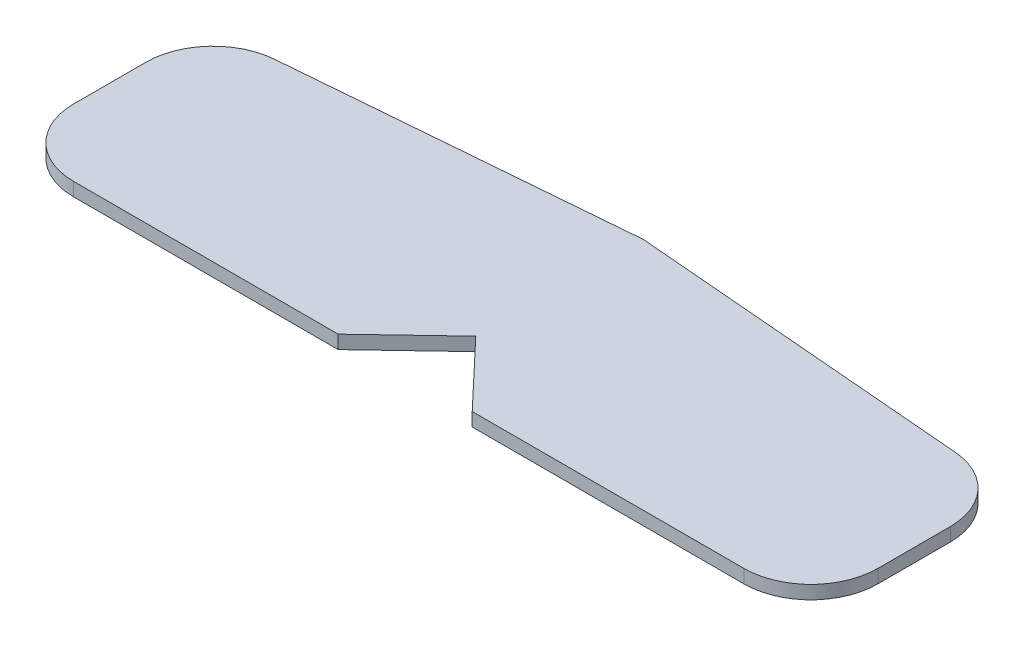
ISO-10303-21;
HEADER;
FILE_DESCRIPTION(('STEP AP214'),'2;1');
FILE_NAME('part.step','',(''),(''),'','','');
FILE_SCHEMA(('AUTOMOTIVE_DESIGN { 1 0 10303 214 1 1 1 1 }'));
ENDSEC;
DATA;
#1=APPLICATION_CONTEXT('core data for automotive mechanical design processes');
#2=APPLICATION_PROTOCOL_DEFINITION('international standard','automotive_design',2000,#1);
#3=PRODUCT_CONTEXT('',#1,'mechanical');
#4=PRODUCT('Part','Part','',(#3));
#5=PRODUCT_RELATED_PRODUCT_CATEGORY('part','',(#4));
#6=PRODUCT_DEFINITION_FORMATION('','',#4);
#7=PRODUCT_DEFINITION_CONTEXT('part definition',#1,'design');
#8=PRODUCT_DEFINITION('design','',#6,#7);
#9=PRODUCT_DEFINITION_SHAPE('','',#8);
#10=(LENGTH_UNIT() NAMED_UNIT(*) SI_UNIT(.MILLI.,.METRE.));
#11=(NAMED_UNIT(*) PLANE_ANGLE_UNIT() SI_UNIT($,.RADIAN.));
#12=(NAMED_UNIT(*) SI_UNIT($,.STERADIAN.) SOLID_ANGLE_UNIT());
#13=UNCERTAINTY_MEASURE_WITH_UNIT(LENGTH_MEASURE(1.E-05),#10,'distance_accuracy_value','');
#14=(GEOMETRIC_REPRESENTATION_CONTEXT(3) GLOBAL_UNCERTAINTY_ASSIGNED_CONTEXT((#13)) GLOBAL_UNIT_ASSIGNED_CONTEXT((#10,
#11,#12)) REPRESENTATION_CONTEXT('',''));
#15=CARTESIAN_POINT('',(0.,0.,0.));
#16=DIRECTION('',(0.,0.,1.));
#17=DIRECTION('',(1.,0.,0.));
#18=AXIS2_PLACEMENT_3D('',#15,#16,#17);
#19=CARTESIAN_POINT('',(50.,2.,-3.29867118433976));
#20=DIRECTION('',(0.,-1.,0.));
#21=DIRECTION('',(0.,0.,-1.));
#22=AXIS2_PLACEMENT_3D('',#19,#20,#21);
#23=CYLINDRICAL_SURFACE('',#22,10.);
#24=CARTESIAN_POINT('',(50.,0.,-3.29867118433976));
#25=DIRECTION('',(0.,1.,0.));
#26=DIRECTION('',(0.,0.,-1.));
#27=AXIS2_PLACEMENT_3D('',#24,#25,#26);
#28=CIRCLE('',#27,10.);
#29=CARTESIAN_POINT('',(60.,0.,-3.29867118433969));
#30=VERTEX_POINT('',#29);
#31=CARTESIAN_POINT('',(50.8304547985373,0.,-13.2641287667886));
#32=VERTEX_POINT('',#31);
#33=EDGE_CURVE('E170',#30,#32,#28,.T.);
#34=ORIENTED_EDGE('',*,*,#33,.T.);
#35=DIRECTION('',(0.,-1.,0.));
#36=VECTOR('',#35,1.);
#37=CARTESIAN_POINT('',(50.8304547985373,2.,-13.2641287667886));
#38=LINE('',#37,#36);
#39=CARTESIAN_POINT('',(50.8304547985373,2.,-13.2641287667886));
#40=VERTEX_POINT('',#39);
#41=EDGE_CURVE('E11',#40,#32,#38,.T.);
#42=ORIENTED_EDGE('',*,*,#41,.F.);
#43=CARTESIAN_POINT('',(50.,2.,-3.29867118433976));
#44=DIRECTION('',(0.,1.,0.));
#45=DIRECTION('',(0.,0.,-1.));
#46=AXIS2_PLACEMENT_3D('',#43,#44,#45);
#47=CIRCLE('',#46,10.);
#48=CARTESIAN_POINT('',(60.,2.,-3.29867118433969));
#49=VERTEX_POINT('',#48);
#50=EDGE_CURVE('E204',#49,#40,#47,.T.);
#51=ORIENTED_EDGE('',*,*,#50,.F.);
#52=DIRECTION('',(0.,-1.,0.));
#53=VECTOR('',#52,1.);
#54=CARTESIAN_POINT('',(60.,2.,-3.29867118433969));
#55=LINE('',#54,#53);
#56=EDGE_CURVE('E166',#49,#30,#55,.T.);
#57=ORIENTED_EDGE('',*,*,#56,.T.);
#58=EDGE_LOOP('',(#34,#42,#51,#57));
#59=FACE_BOUND('',#58,.T.);
#60=ADVANCED_FACE('F45',(#59),#23,.T.);
#61=CARTESIAN_POINT('',(0.,2.,-17.5));
#62=DIRECTION('',(-0.08304547985374,0.,0.99654575824488));
#63=DIRECTION('',(0.99654575824488,0.,0.08304547985374));
#64=AXIS2_PLACEMENT_3D('',#61,#62,#63);
#65=PLANE('',#64);
#66=DIRECTION('',(-0.99654575824488,0.,-0.08304547985374));
#67=VECTOR('',#66,1.);
#68=CARTESIAN_POINT('',(0.,0.,-17.5));
#69=LINE('',#68,#67);
#70=CARTESIAN_POINT('',(0.,0.,-17.5));
#71=VERTEX_POINT('',#70);
#72=EDGE_CURVE('E174',#32,#71,#69,.T.);
#73=ORIENTED_EDGE('',*,*,#72,.T.);
#74=DIRECTION('',(0.,-1.,0.));
#75=VECTOR('',#74,1.);
#76=CARTESIAN_POINT('',(0.,2.,-17.5));
#77=LINE('',#76,#75);
#78=CARTESIAN_POINT('',(0.,2.,-17.5));
#79=VERTEX_POINT('',#78);
#80=EDGE_CURVE('E54',#79,#71,#77,.T.);
#81=ORIENTED_EDGE('',*,*,#80,.F.);
#82=DIRECTION('',(-0.99654575824488,0.,-0.08304547985374));
#83=VECTOR('',#82,1.);
#84=CARTESIAN_POINT('',(0.,2.,-17.5));
#85=LINE('',#84,#83);
#86=EDGE_CURVE('E117',#40,#79,#85,.T.);
#87=ORIENTED_EDGE('',*,*,#86,.F.);
#88=ORIENTED_EDGE('',*,*,#41,.T.);
#89=EDGE_LOOP('',(#73,#81,#87,#88));
#90=FACE_BOUND('',#89,.T.);
#91=ADVANCED_FACE('F298',(#90),#65,.F.);
#92=CARTESIAN_POINT('',(-50.8304547985373,2.,-13.2641287667886));
#93=DIRECTION('',(0.08304547985374,0.,0.99654575824488));
#94=DIRECTION('',(0.99654575824488,0.,-0.08304547985374));
#95=AXIS2_PLACEMENT_3D('',#92,#93,#94);
#96=PLANE('',#95);
#97=DIRECTION('',(-0.99654575824488,0.,0.08304547985374));
#98=VECTOR('',#97,1.);
#99=CARTESIAN_POINT('',(-50.8304547985373,0.,-13.2641287667886));
#100=LINE('',#99,#98);
#101=CARTESIAN_POINT('',(-50.8304547985373,0.,-13.2641287667886));
#102=VERTEX_POINT('',#101);
#103=EDGE_CURVE('E177',#71,#102,#100,.T.);
#104=ORIENTED_EDGE('',*,*,#103,.T.);
#105=DIRECTION('',(0.,-1.,0.));
#106=VECTOR('',#105,1.);
#107=CARTESIAN_POINT('',(-50.8304547985373,2.,-13.2641287667886));
#108=LINE('',#107,#106);
#109=CARTESIAN_POINT('',(-50.8304547985373,2.,-13.2641287667886));
#110=VERTEX_POINT('',#109);
#111=EDGE_CURVE('E231',#110,#102,#108,.T.);
#112=ORIENTED_EDGE('',*,*,#111,.F.);
#113=DIRECTION('',(-0.99654575824488,0.,0.08304547985374));
#114=VECTOR('',#113,1.);
#115=CARTESIAN_POINT('',(-50.8304547985373,2.,-13.2641287667886));
#116=LINE('',#115,#114);
#117=EDGE_CURVE('E241',#79,#110,#116,.T.);
#118=ORIENTED_EDGE('',*,*,#117,.F.);
#119=ORIENTED_EDGE('',*,*,#80,.T.);
#120=EDGE_LOOP('',(#104,#112,#118,#119));
#121=FACE_BOUND('',#120,.T.);
#122=ADVANCED_FACE('F239',(#121),#96,.F.);
#123=CARTESIAN_POINT('',(-50.,2.,-3.29867118433976));
#124=DIRECTION('',(0.,-1.,0.));
#125=DIRECTION('',(0.,0.,-1.));
#126=AXIS2_PLACEMENT_3D('',#123,#124,#125);
#127=CYLINDRICAL_SURFACE('',#126,10.);
#128=CARTESIAN_POINT('',(-50.,0.,-3.29867118433976));
#129=DIRECTION('',(0.,1.,0.));
#130=DIRECTION('',(0.,0.,1.));
#131=AXIS2_PLACEMENT_3D('',#128,#129,#130);
#132=CIRCLE('',#131,10.);
#133=CARTESIAN_POINT('',(-60.,0.,-3.2986711843397));
#134=VERTEX_POINT('',#133);
#135=EDGE_CURVE('E180',#102,#134,#132,.T.);
#136=ORIENTED_EDGE('',*,*,#135,.T.);
#137=DIRECTION('',(0.,-1.,0.));
#138=VECTOR('',#137,1.);
#139=CARTESIAN_POINT('',(-60.,2.,-3.2986711843397));
#140=LINE('',#139,#138);
#141=CARTESIAN_POINT('',(-60.,2.,-3.2986711843397));
#142=VERTEX_POINT('',#141);
#143=EDGE_CURVE('E227',#142,#134,#140,.T.);
#144=ORIENTED_EDGE('',*,*,#143,.F.);
#145=CARTESIAN_POINT('',(-50.,2.,-3.29867118433976));
#146=DIRECTION('',(0.,1.,0.));
#147=DIRECTION('',(0.,0.,1.));
#148=AXIS2_PLACEMENT_3D('',#145,#146,#147);
#149=CIRCLE('',#148,10.);
#150=EDGE_CURVE('E260',#110,#142,#149,.T.);
#151=ORIENTED_EDGE('',*,*,#150,.F.);
#152=ORIENTED_EDGE('',*,*,#111,.T.);
#153=EDGE_LOOP('',(#136,#144,#151,#152));
#154=FACE_BOUND('',#153,.T.);
#155=ADVANCED_FACE('F250',(#154),#127,.T.);
#156=CARTESIAN_POINT('',(-60.,2.,7.49999999999993));
#157=DIRECTION('',(1.,0.,0.));
#158=DIRECTION('',(0.,0.,-1.));
#159=AXIS2_PLACEMENT_3D('',#156,#157,#158);
#160=PLANE('',#159);
#161=DIRECTION('',(0.,0.,1.));
#162=VECTOR('',#161,1.);
#163=CARTESIAN_POINT('',(-60.,0.,7.49999999999993));
#164=LINE('',#163,#162);
#165=CARTESIAN_POINT('',(-60.,0.,7.49999999999993));
#166=VERTEX_POINT('',#165);
#167=EDGE_CURVE('E183',#134,#166,#164,.T.);
#168=ORIENTED_EDGE('',*,*,#167,.T.);
#169=DIRECTION('',(0.,-1.,0.));
#170=VECTOR('',#169,1.);
#171=CARTESIAN_POINT('',(-60.,2.,7.49999999999993));
#172=LINE('',#171,#170);
#173=CARTESIAN_POINT('',(-60.,2.,7.49999999999993));
#174=VERTEX_POINT('',#173);
#175=EDGE_CURVE('E223',#174,#166,#172,.T.);
#176=ORIENTED_EDGE('',*,*,#175,.F.);
#177=DIRECTION('',(0.,0.,1.));
#178=VECTOR('',#177,1.);
#179=CARTESIAN_POINT('',(-60.,2.,7.49999999999993));
#180=LINE('',#179,#178);
#181=EDGE_CURVE('E256',#142,#174,#180,.T.);
#182=ORIENTED_EDGE('',*,*,#181,.F.);
#183=ORIENTED_EDGE('',*,*,#143,.T.);
#184=EDGE_LOOP('',(#168,#176,#182,#183));
#185=FACE_BOUND('',#184,.T.);
#186=ADVANCED_FACE('F254',(#185),#160,.F.);
#187=CARTESIAN_POINT('',(-50.,2.,7.5));
#188=DIRECTION('',(0.,-1.,0.));
#189=DIRECTION('',(0.,0.,-1.));
#190=AXIS2_PLACEMENT_3D('',#187,#188,#189);
#191=CYLINDRICAL_SURFACE('',#190,10.);
#192=CARTESIAN_POINT('',(-50.,0.,7.5));
#193=DIRECTION('',(0.,1.,0.));
#194=DIRECTION('',(0.,0.,-1.));
#195=AXIS2_PLACEMENT_3D('',#192,#193,#194);
#196=CIRCLE('',#195,10.);
#197=CARTESIAN_POINT('',(-49.9999999999999,0.,17.5));
#198=VERTEX_POINT('',#197);
#199=EDGE_CURVE('E186',#166,#198,#196,.T.);
#200=ORIENTED_EDGE('',*,*,#199,.T.);
#201=DIRECTION('',(0.,-1.,0.));
#202=VECTOR('',#201,1.);
#203=CARTESIAN_POINT('',(-49.9999999999999,2.,17.5));
#204=LINE('',#203,#202);
#205=CARTESIAN_POINT('',(-49.9999999999999,2.,17.5));
#206=VERTEX_POINT('',#205);
#207=EDGE_CURVE('E219',#206,#198,#204,.T.);
#208=ORIENTED_EDGE('',*,*,#207,.F.);
#209=CARTESIAN_POINT('',(-50.,2.,7.5));
#210=DIRECTION('',(0.,1.,0.));
#211=DIRECTION('',(0.,0.,-1.));
#212=AXIS2_PLACEMENT_3D('',#209,#210,#211);
#213=CIRCLE('',#212,10.);
#214=EDGE_CURVE('E259',#174,#206,#213,.T.);
#215=ORIENTED_EDGE('',*,*,#214,.F.);
#216=ORIENTED_EDGE('',*,*,#175,.T.);
#217=EDGE_LOOP('',(#200,#208,#215,#216));
#218=FACE_BOUND('',#217,.T.);
#219=ADVANCED_FACE('F311',(#218),#191,.T.);
#220=CARTESIAN_POINT('',(-49.9999999999999,2.,17.5));
#221=DIRECTION('',(0.,0.,-1.));
#222=DIRECTION('',(-1.,0.,0.));
#223=AXIS2_PLACEMENT_3D('',#220,#221,#222);
#224=PLANE('',#223);
#225=DIRECTION('',(1.,0.,0.));
#226=VECTOR('',#225,1.);
#227=CARTESIAN_POINT('',(-49.9999999999999,0.,17.5));
#228=LINE('',#227,#226);
#229=CARTESIAN_POINT('',(-10.5290456431535,0.,17.5));
#230=VERTEX_POINT('',#229);
#231=EDGE_CURVE('E189',#198,#230,#228,.T.);
#232=ORIENTED_EDGE('',*,*,#231,.T.);
#233=DIRECTION('',(0.,-1.,0.));
#234=VECTOR('',#233,1.);
#235=CARTESIAN_POINT('',(-10.5290456431535,2.,17.5));
#236=LINE('',#235,#234);
#237=CARTESIAN_POINT('',(-10.5290456431535,2.,17.5));
#238=VERTEX_POINT('',#237);
#239=EDGE_CURVE('E215',#238,#230,#236,.T.);
#240=ORIENTED_EDGE('',*,*,#239,.F.);
#241=DIRECTION('',(1.,0.,0.));
#242=VECTOR('',#241,1.);
#243=CARTESIAN_POINT('',(-49.9999999999999,2.,17.5));
#244=LINE('',#243,#242);
#245=EDGE_CURVE('E264',#206,#238,#244,.T.);
#246=ORIENTED_EDGE('',*,*,#245,.F.);
#247=ORIENTED_EDGE('',*,*,#207,.T.);
#248=EDGE_LOOP('',(#232,#240,#246,#247));
#249=FACE_BOUND('',#248,.T.);
#250=ADVANCED_FACE('F314',(#249),#224,.F.);
#251=CARTESIAN_POINT('',(-10.5290456431535,2.,17.5));
#252=DIRECTION('',(-0.688655583209343,0.,-0.725088606802368));
#253=DIRECTION('',(-0.725088606802368,0.,0.688655583209343));
#254=AXIS2_PLACEMENT_3D('',#251,#252,#253);
#255=PLANE('',#254);
#256=DIRECTION('',(0.725088606802368,0.,-0.688655583209343));
#257=VECTOR('',#256,1.);
#258=CARTESIAN_POINT('',(-10.5290456431535,0.,17.5));
#259=LINE('',#258,#257);
#260=CARTESIAN_POINT('',(0.,0.,7.5));
#261=VERTEX_POINT('',#260);
#262=EDGE_CURVE('E192',#230,#261,#259,.T.);
#263=ORIENTED_EDGE('',*,*,#262,.T.);
#264=DIRECTION('',(0.,-1.,0.));
#265=VECTOR('',#264,1.);
#266=CARTESIAN_POINT('',(0.,2.,7.5));
#267=LINE('',#266,#265);
#268=CARTESIAN_POINT('',(0.,2.,7.5));
#269=VERTEX_POINT('',#268);
#270=EDGE_CURVE('E211',#269,#261,#267,.T.);
#271=ORIENTED_EDGE('',*,*,#270,.F.);
#272=DIRECTION('',(0.725088606802368,0.,-0.688655583209343));
#273=VECTOR('',#272,1.);
#274=CARTESIAN_POINT('',(-10.5290456431535,2.,17.5));
#275=LINE('',#274,#273);
#276=EDGE_CURVE('E271',#238,#269,#275,.T.);
#277=ORIENTED_EDGE('',*,*,#276,.F.);
#278=ORIENTED_EDGE('',*,*,#239,.T.);
#279=EDGE_LOOP('',(#263,#271,#277,#278));
#280=FACE_BOUND('',#279,.T.);
#281=ADVANCED_FACE('F279',(#280),#255,.F.);
#282=CARTESIAN_POINT('',(0.,2.,7.5));
#283=DIRECTION('',(0.726051632454601,0.,-0.68764018716914));
#284=DIRECTION('',(-0.68764018716914,0.,-0.726051632454601));
#285=AXIS2_PLACEMENT_3D('',#282,#283,#284);
#286=PLANE('',#285);
#287=DIRECTION('',(0.68764018716914,0.,0.726051632454601));
#288=VECTOR('',#287,1.);
#289=CARTESIAN_POINT('',(0.,0.,7.5));
#290=LINE('',#289,#288);
#291=CARTESIAN_POINT('',(9.47095435684648,0.,17.5));
#292=VERTEX_POINT('',#291);
#293=EDGE_CURVE('E195',#261,#292,#290,.T.);
#294=ORIENTED_EDGE('',*,*,#293,.T.);
#295=DIRECTION('',(0.,-1.,0.));
#296=VECTOR('',#295,1.);
#297=CARTESIAN_POINT('',(9.47095435684648,2.,17.5));
#298=LINE('',#297,#296);
#299=CARTESIAN_POINT('',(9.47095435684648,2.,17.5));
#300=VERTEX_POINT('',#299);
#301=EDGE_CURVE('E159',#300,#292,#298,.T.);
#302=ORIENTED_EDGE('',*,*,#301,.F.);
#303=DIRECTION('',(0.68764018716914,0.,0.726051632454601));
#304=VECTOR('',#303,1.);
#305=CARTESIAN_POINT('',(0.,2.,7.5));
#306=LINE('',#305,#304);
#307=EDGE_CURVE('E148',#269,#300,#306,.T.);
#308=ORIENTED_EDGE('',*,*,#307,.F.);
#309=ORIENTED_EDGE('',*,*,#270,.T.);
#310=EDGE_LOOP('',(#294,#302,#308,#309));
#311=FACE_BOUND('',#310,.T.);
#312=ADVANCED_FACE('F283',(#311),#286,.F.);
#313=CARTESIAN_POINT('',(9.47095435684648,2.,17.5));
#314=DIRECTION('',(0.,0.,-1.));
#315=DIRECTION('',(-1.,0.,0.));
#316=AXIS2_PLACEMENT_3D('',#313,#314,#315);
#317=PLANE('',#316);
#318=DIRECTION('',(1.,0.,0.));
#319=VECTOR('',#318,1.);
#320=CARTESIAN_POINT('',(9.47095435684648,0.,17.5));
#321=LINE('',#320,#319);
#322=CARTESIAN_POINT('',(49.9999999999999,0.,17.5));
#323=VERTEX_POINT('',#322);
#324=EDGE_CURVE('E157',#292,#323,#321,.T.);
#325=ORIENTED_EDGE('',*,*,#324,.T.);
#326=DIRECTION('',(0.,-1.,0.));
#327=VECTOR('',#326,1.);
#328=CARTESIAN_POINT('',(49.9999999999999,2.,17.5));
#329=LINE('',#328,#327);
#330=CARTESIAN_POINT('',(49.9999999999999,2.,17.5));
#331=VERTEX_POINT('',#330);
#332=EDGE_CURVE('E154',#331,#323,#329,.T.);
#333=ORIENTED_EDGE('',*,*,#332,.F.);
#334=DIRECTION('',(1.,0.,0.));
#335=VECTOR('',#334,1.);
#336=CARTESIAN_POINT('',(9.47095435684648,2.,17.5));
#337=LINE('',#336,#335);
#338=EDGE_CURVE('E142',#300,#331,#337,.T.);
#339=ORIENTED_EDGE('',*,*,#338,.F.);
#340=ORIENTED_EDGE('',*,*,#301,.T.);
#341=EDGE_LOOP('',(#325,#333,#339,#340));
#342=FACE_BOUND('',#341,.T.);
#343=ADVANCED_FACE('F155',(#342),#317,.F.);
#344=CARTESIAN_POINT('',(50.,2.,7.5));
#345=DIRECTION('',(0.,-1.,0.));
#346=DIRECTION('',(0.,0.,-1.));
#347=AXIS2_PLACEMENT_3D('',#344,#345,#346);
#348=CYLINDRICAL_SURFACE('',#347,10.);
#349=CARTESIAN_POINT('',(50.,0.,7.5));
#350=DIRECTION('',(0.,1.,0.));
#351=DIRECTION('',(0.,0.,1.));
#352=AXIS2_PLACEMENT_3D('',#349,#350,#351);
#353=CIRCLE('',#352,10.);
#354=CARTESIAN_POINT('',(60.,0.,7.49999999999993));
#355=VERTEX_POINT('',#354);
#356=EDGE_CURVE('E103',#323,#355,#353,.T.);
#357=ORIENTED_EDGE('',*,*,#356,.T.);
#358=DIRECTION('',(0.,-1.,0.));
#359=VECTOR('',#358,1.);
#360=CARTESIAN_POINT('',(60.,2.,7.49999999999993));
#361=LINE('',#360,#359);
#362=CARTESIAN_POINT('',(60.,2.,7.49999999999993));
#363=VERTEX_POINT('',#362);
#364=EDGE_CURVE('E160',#363,#355,#361,.T.);
#365=ORIENTED_EDGE('',*,*,#364,.F.);
#366=CARTESIAN_POINT('',(50.,2.,7.5));
#367=DIRECTION('',(0.,1.,0.));
#368=DIRECTION('',(0.,0.,1.));
#369=AXIS2_PLACEMENT_3D('',#366,#367,#368);
#370=CIRCLE('',#369,10.);
#371=EDGE_CURVE('E146',#331,#363,#370,.T.);
#372=ORIENTED_EDGE('',*,*,#371,.F.);
#373=ORIENTED_EDGE('',*,*,#332,.T.);
#374=EDGE_LOOP('',(#357,#365,#372,#373));
#375=FACE_BOUND('',#374,.T.);
#376=ADVANCED_FACE('F162',(#375),#348,.T.);
#377=CARTESIAN_POINT('',(60.,2.,7.49999999999993));
#378=DIRECTION('',(-1.,0.,0.));
#379=DIRECTION('',(0.,0.,1.));
#380=AXIS2_PLACEMENT_3D('',#377,#378,#379);
#381=PLANE('',#380);
#382=DIRECTION('',(0.,0.,-1.));
#383=VECTOR('',#382,1.);
#384=CARTESIAN_POINT('',(60.,0.,7.49999999999993));
#385=LINE('',#384,#383);
#386=EDGE_CURVE('E109',#355,#30,#385,.T.);
#387=ORIENTED_EDGE('',*,*,#386,.T.);
#388=ORIENTED_EDGE('',*,*,#56,.F.);
#389=DIRECTION('',(0.,0.,-1.));
#390=VECTOR('',#389,1.);
#391=CARTESIAN_POINT('',(60.,2.,7.49999999999993));
#392=LINE('',#391,#390);
#393=EDGE_CURVE('E62',#363,#49,#392,.T.);
#394=ORIENTED_EDGE('',*,*,#393,.F.);
#395=ORIENTED_EDGE('',*,*,#364,.T.);
#396=EDGE_LOOP('',(#387,#388,#394,#395));
#397=FACE_BOUND('',#396,.T.);
#398=ADVANCED_FACE('F287',(#397),#381,.F.);
#399=CARTESIAN_POINT('',(50.,2.,-3.29867118433976));
#400=DIRECTION('',(0.,-1.,0.));
#401=DIRECTION('',(0.,0.,-1.));
#402=AXIS2_PLACEMENT_3D('',#399,#400,#401);
#403=PLANE('',#402);
#404=ORIENTED_EDGE('',*,*,#50,.T.);
#405=ORIENTED_EDGE('',*,*,#86,.T.);
#406=ORIENTED_EDGE('',*,*,#117,.T.);
#407=ORIENTED_EDGE('',*,*,#150,.T.);
#408=ORIENTED_EDGE('',*,*,#181,.T.);
#409=ORIENTED_EDGE('',*,*,#214,.T.);
#410=ORIENTED_EDGE('',*,*,#245,.T.);
#411=ORIENTED_EDGE('',*,*,#276,.T.);
#412=ORIENTED_EDGE('',*,*,#307,.T.);
#413=ORIENTED_EDGE('',*,*,#338,.T.);
#414=ORIENTED_EDGE('',*,*,#371,.T.);
#415=ORIENTED_EDGE('',*,*,#393,.T.);
#416=EDGE_LOOP('',(#404,#405,#406,#407,#408,#409,#410,#411,#412,#413,#414,#415));
#417=FACE_BOUND('',#416,.T.);
#418=ADVANCED_FACE('F144',(#417),#403,.F.);
#419=CARTESIAN_POINT('',(50.,0.,-3.29867118433976));
#420=DIRECTION('',(0.,-1.,0.));
#421=DIRECTION('',(0.,0.,-1.));
#422=AXIS2_PLACEMENT_3D('',#419,#420,#421);
#423=PLANE('',#422);
#424=ORIENTED_EDGE('',*,*,#33,.F.);
#425=ORIENTED_EDGE('',*,*,#386,.F.);
#426=ORIENTED_EDGE('',*,*,#356,.F.);
#427=ORIENTED_EDGE('',*,*,#324,.F.);
#428=ORIENTED_EDGE('',*,*,#293,.F.);
#429=ORIENTED_EDGE('',*,*,#262,.F.);
#430=ORIENTED_EDGE('',*,*,#231,.F.);
#431=ORIENTED_EDGE('',*,*,#199,.F.);
#432=ORIENTED_EDGE('',*,*,#167,.F.);
#433=ORIENTED_EDGE('',*,*,#135,.F.);
#434=ORIENTED_EDGE('',*,*,#103,.F.);
#435=ORIENTED_EDGE('',*,*,#72,.F.);
#436=EDGE_LOOP('',(#424,#425,#426,#427,#428,#429,#430,#431,#432,#433,#434,#435));
#437=FACE_BOUND('',#436,.T.);
#438=ADVANCED_FACE('F245',(#437),#423,.T.);
#439=CLOSED_SHELL('',(#60,#91,#122,#155,#186,#219,#250,#281,#312,#343,#376,#398,#418,#438));
#440=MANIFOLD_SOLID_BREP('B2',#439);
#441=ADVANCED_BREP_SHAPE_REPRESENTATION('',(#18,#440),#14);
#442=SHAPE_DEFINITION_REPRESENTATION(#9,#441);
ENDSEC;
END-ISO-10303-21;
